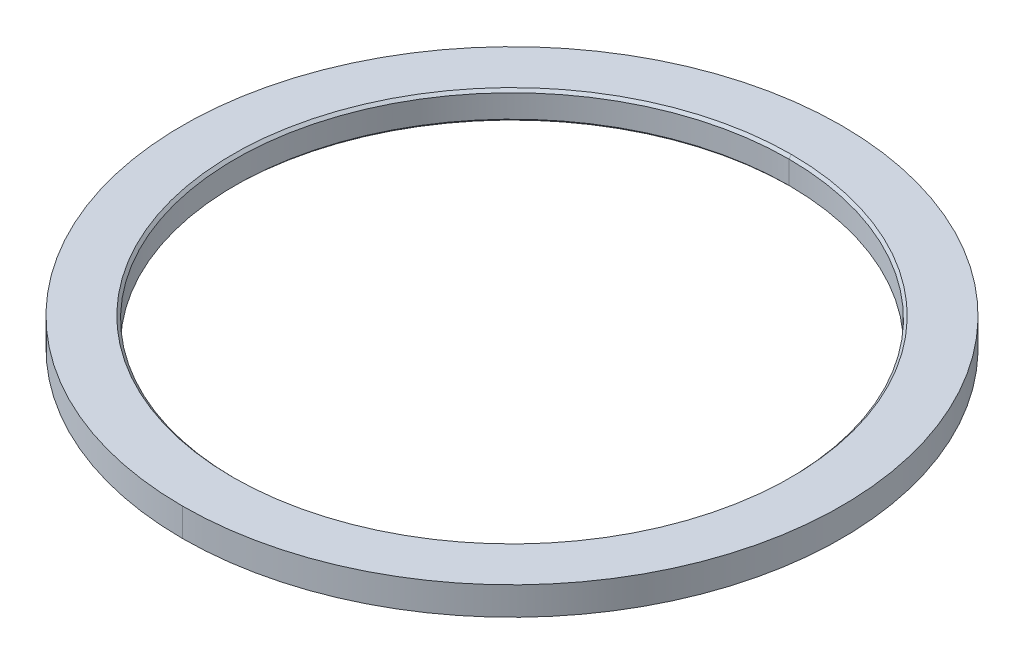
ISO-10303-21;
HEADER;
FILE_DESCRIPTION(('STEP AP214'),'2;1');
FILE_NAME('part.step','',(''),(''),'','','');
FILE_SCHEMA(('AUTOMOTIVE_DESIGN { 1 0 10303 214 1 1 1 1 }'));
ENDSEC;
DATA;
#1=APPLICATION_CONTEXT('core data for automotive mechanical design processes');
#2=APPLICATION_PROTOCOL_DEFINITION('international standard','automotive_design',2000,#1);
#3=PRODUCT_CONTEXT('',#1,'mechanical');
#4=PRODUCT('Part','Part','',(#3));
#5=PRODUCT_RELATED_PRODUCT_CATEGORY('part','',(#4));
#6=PRODUCT_DEFINITION_FORMATION('','',#4);
#7=PRODUCT_DEFINITION_CONTEXT('part definition',#1,'design');
#8=PRODUCT_DEFINITION('design','',#6,#7);
#9=PRODUCT_DEFINITION_SHAPE('','',#8);
#10=(LENGTH_UNIT() NAMED_UNIT(*) SI_UNIT(.MILLI.,.METRE.));
#11=(NAMED_UNIT(*) PLANE_ANGLE_UNIT() SI_UNIT($,.RADIAN.));
#12=(NAMED_UNIT(*) SI_UNIT($,.STERADIAN.) SOLID_ANGLE_UNIT());
#13=UNCERTAINTY_MEASURE_WITH_UNIT(LENGTH_MEASURE(1.E-05),#10,'distance_accuracy_value','');
#14=(GEOMETRIC_REPRESENTATION_CONTEXT(3) GLOBAL_UNCERTAINTY_ASSIGNED_CONTEXT((#13)) GLOBAL_UNIT_ASSIGNED_CONTEXT((#10,
#11,#12)) REPRESENTATION_CONTEXT('',''));
#15=CARTESIAN_POINT('',(0.,0.,0.));
#16=DIRECTION('',(0.,0.,1.));
#17=DIRECTION('',(1.,0.,0.));
#18=AXIS2_PLACEMENT_3D('',#15,#16,#17);
#19=CARTESIAN_POINT('',(0.,3.2,0.));
#20=DIRECTION('',(0.,1.,0.));
#21=DIRECTION('',(-1.,0.,0.));
#22=AXIS2_PLACEMENT_3D('',#19,#20,#21);
#23=CONICAL_SURFACE('',#22,31.8,0.785398163397452);
#24=CARTESIAN_POINT('',(0.,2.9,0.));
#25=DIRECTION('',(0.,-1.,0.));
#26=DIRECTION('',(0.,0.,-1.));
#27=AXIS2_PLACEMENT_3D('',#24,#25,#26);
#28=CIRCLE('',#27,31.5);
#29=CARTESIAN_POINT('',(0.,2.9,-31.5));
#30=VERTEX_POINT('',#29);
#31=CARTESIAN_POINT('',(0.,2.9,31.5));
#32=VERTEX_POINT('',#31);
#33=EDGE_CURVE('E100',#30,#32,#28,.T.);
#34=ORIENTED_EDGE('',*,*,#33,.T.);
#35=DIRECTION('',(0.,-0.707106781186546,-0.70710678118655));
#36=VECTOR('',#35,1.);
#37=CARTESIAN_POINT('',(0.,2.9,31.5));
#38=LINE('',#37,#36);
#39=CARTESIAN_POINT('',(0.,3.2,31.8));
#40=VERTEX_POINT('',#39);
#41=EDGE_CURVE('E67',#32,#40,#38,.F.);
#42=ORIENTED_EDGE('',*,*,#41,.T.);
#43=CARTESIAN_POINT('',(0.,3.2,0.));
#44=DIRECTION('',(0.,1.,0.));
#45=DIRECTION('',(-1.,0.,0.));
#46=AXIS2_PLACEMENT_3D('',#43,#44,#45);
#47=CIRCLE('',#46,31.8);
#48=CARTESIAN_POINT('',(0.,3.2,-31.8));
#49=VERTEX_POINT('',#48);
#50=EDGE_CURVE('E21',#40,#49,#47,.T.);
#51=ORIENTED_EDGE('',*,*,#50,.T.);
#52=DIRECTION('',(0.,-0.707106781186546,0.70710678118655));
#53=VECTOR('',#52,1.);
#54=CARTESIAN_POINT('',(0.,2.9,-31.5));
#55=LINE('',#54,#53);
#56=EDGE_CURVE('E124',#49,#30,#55,.T.);
#57=ORIENTED_EDGE('',*,*,#56,.T.);
#58=EDGE_LOOP('',(#34,#42,#51,#57));
#59=FACE_BOUND('',#58,.T.);
#60=ADVANCED_FACE('F18',(#59),#23,.F.);
#61=CARTESIAN_POINT('',(0.,3.2,0.));
#62=DIRECTION('',(0.,1.,0.));
#63=DIRECTION('',(-1.,0.,0.));
#64=AXIS2_PLACEMENT_3D('',#61,#62,#63);
#65=CONICAL_SURFACE('',#64,31.8,0.785398163397452);
#66=ORIENTED_EDGE('',*,*,#56,.F.);
#67=CARTESIAN_POINT('',(0.,3.2,0.));
#68=DIRECTION('',(0.,1.,0.));
#69=DIRECTION('',(-1.,0.,0.));
#70=AXIS2_PLACEMENT_3D('',#67,#68,#69);
#71=CIRCLE('',#70,31.8);
#72=EDGE_CURVE('E90',#49,#40,#71,.T.);
#73=ORIENTED_EDGE('',*,*,#72,.T.);
#74=ORIENTED_EDGE('',*,*,#41,.F.);
#75=CARTESIAN_POINT('',(0.,2.9,0.));
#76=DIRECTION('',(0.,-1.,0.));
#77=DIRECTION('',(0.,0.,-1.));
#78=AXIS2_PLACEMENT_3D('',#75,#76,#77);
#79=CIRCLE('',#78,31.5);
#80=EDGE_CURVE('E95',#32,#30,#79,.T.);
#81=ORIENTED_EDGE('',*,*,#80,.T.);
#82=EDGE_LOOP('',(#66,#73,#74,#81));
#83=FACE_BOUND('',#82,.T.);
#84=ADVANCED_FACE('F145',(#83),#65,.F.);
#85=CARTESIAN_POINT('',(0.,0.,0.));
#86=DIRECTION('',(0.,-1.,0.));
#87=DIRECTION('',(0.,0.,-1.));
#88=AXIS2_PLACEMENT_3D('',#85,#86,#87);
#89=CYLINDRICAL_SURFACE('',#88,31.5);
#90=DIRECTION('',(0.,-1.,0.));
#91=VECTOR('',#90,1.);
#92=CARTESIAN_POINT('',(0.,0.,31.5));
#93=LINE('',#92,#91);
#94=CARTESIAN_POINT('',(0.,0.300000000000001,31.5));
#95=VERTEX_POINT('',#94);
#96=EDGE_CURVE('E93',#32,#95,#93,.T.);
#97=ORIENTED_EDGE('',*,*,#96,.T.);
#98=CARTESIAN_POINT('',(0.,0.300000000000002,0.));
#99=DIRECTION('',(0.,-1.,0.));
#100=DIRECTION('',(0.,0.,-1.));
#101=AXIS2_PLACEMENT_3D('',#98,#99,#100);
#102=CIRCLE('',#101,31.5);
#103=CARTESIAN_POINT('',(0.,0.300000000000001,-31.5));
#104=VERTEX_POINT('',#103);
#105=EDGE_CURVE('E79',#95,#104,#102,.T.);
#106=ORIENTED_EDGE('',*,*,#105,.T.);
#107=DIRECTION('',(0.,-1.,0.));
#108=VECTOR('',#107,1.);
#109=CARTESIAN_POINT('',(0.,0.,-31.5));
#110=LINE('',#109,#108);
#111=EDGE_CURVE('E110',#104,#30,#110,.F.);
#112=ORIENTED_EDGE('',*,*,#111,.T.);
#113=ORIENTED_EDGE('',*,*,#80,.F.);
#114=EDGE_LOOP('',(#97,#106,#112,#113));
#115=FACE_BOUND('',#114,.T.);
#116=ADVANCED_FACE('F94',(#115),#89,.F.);
#117=CARTESIAN_POINT('',(0.,0.,0.));
#118=DIRECTION('',(0.,-1.,0.));
#119=DIRECTION('',(0.,0.,-1.));
#120=AXIS2_PLACEMENT_3D('',#117,#118,#119);
#121=CYLINDRICAL_SURFACE('',#120,31.5);
#122=ORIENTED_EDGE('',*,*,#33,.F.);
#123=ORIENTED_EDGE('',*,*,#111,.F.);
#124=CARTESIAN_POINT('',(0.,0.300000000000002,0.));
#125=DIRECTION('',(0.,-1.,0.));
#126=DIRECTION('',(0.,0.,-1.));
#127=AXIS2_PLACEMENT_3D('',#124,#125,#126);
#128=CIRCLE('',#127,31.5);
#129=EDGE_CURVE('E104',#104,#95,#128,.T.);
#130=ORIENTED_EDGE('',*,*,#129,.T.);
#131=ORIENTED_EDGE('',*,*,#96,.F.);
#132=EDGE_LOOP('',(#122,#123,#130,#131));
#133=FACE_BOUND('',#132,.T.);
#134=ADVANCED_FACE('F109',(#133),#121,.F.);
#135=CARTESIAN_POINT('',(-33.25,3.2,0.));
#136=DIRECTION('',(0.,-1.,0.));
#137=DIRECTION('',(0.,0.,-1.));
#138=AXIS2_PLACEMENT_3D('',#135,#136,#137);
#139=PLANE('',#138);
#140=CARTESIAN_POINT('',(0.,3.19999999999999,0.));
#141=DIRECTION('',(0.,1.,0.));
#142=DIRECTION('',(0.,0.,1.));
#143=AXIS2_PLACEMENT_3D('',#140,#141,#142);
#144=CIRCLE('',#143,37.5);
#145=CARTESIAN_POINT('',(0.,3.19999999999999,37.5));
#146=VERTEX_POINT('',#145);
#147=CARTESIAN_POINT('',(0.,3.19999999999999,-37.5));
#148=VERTEX_POINT('',#147);
#149=EDGE_CURVE('E141',#146,#148,#144,.F.);
#150=ORIENTED_EDGE('',*,*,#149,.F.);
#151=CARTESIAN_POINT('',(0.,3.19999999999999,0.));
#152=DIRECTION('',(0.,1.,0.));
#153=DIRECTION('',(0.,0.,1.));
#154=AXIS2_PLACEMENT_3D('',#151,#152,#153);
#155=CIRCLE('',#154,37.5);
#156=EDGE_CURVE('E107',#148,#146,#155,.F.);
#157=ORIENTED_EDGE('',*,*,#156,.F.);
#158=EDGE_LOOP('',(#150,#157));
#159=FACE_BOUND('',#158,.T.);
#160=ORIENTED_EDGE('',*,*,#50,.F.);
#161=ORIENTED_EDGE('',*,*,#72,.F.);
#162=EDGE_LOOP('',(#160,#161));
#163=FACE_BOUND('',#162,.T.);
#164=ADVANCED_FACE('F172',(#159,#163),#139,.F.);
#165=CARTESIAN_POINT('',(0.,0.,0.));
#166=DIRECTION('',(0.,-1.,0.));
#167=DIRECTION('',(0.,0.,-1.));
#168=AXIS2_PLACEMENT_3D('',#165,#166,#167);
#169=CONICAL_SURFACE('',#168,31.8,0.785398163397452);
#170=DIRECTION('',(0.,0.707106781186546,-0.70710678118655));
#171=VECTOR('',#170,1.);
#172=CARTESIAN_POINT('',(0.,0.,31.8));
#173=LINE('',#172,#171);
#174=CARTESIAN_POINT('',(0.,0.,31.8));
#175=VERTEX_POINT('',#174);
#176=EDGE_CURVE('E84',#95,#175,#173,.F.);
#177=ORIENTED_EDGE('',*,*,#176,.T.);
#178=CARTESIAN_POINT('',(0.,0.,0.));
#179=DIRECTION('',(0.,-1.,0.));
#180=DIRECTION('',(0.,0.,-1.));
#181=AXIS2_PLACEMENT_3D('',#178,#179,#180);
#182=CIRCLE('',#181,31.8);
#183=CARTESIAN_POINT('',(0.,0.,-31.8));
#184=VERTEX_POINT('',#183);
#185=EDGE_CURVE('E139',#175,#184,#182,.T.);
#186=ORIENTED_EDGE('',*,*,#185,.T.);
#187=DIRECTION('',(0.,0.707106781186546,0.70710678118655));
#188=VECTOR('',#187,1.);
#189=CARTESIAN_POINT('',(0.,0.,-31.8));
#190=LINE('',#189,#188);
#191=EDGE_CURVE('E86',#184,#104,#190,.T.);
#192=ORIENTED_EDGE('',*,*,#191,.T.);
#193=ORIENTED_EDGE('',*,*,#105,.F.);
#194=EDGE_LOOP('',(#177,#186,#192,#193));
#195=FACE_BOUND('',#194,.T.);
#196=ADVANCED_FACE('F81',(#195),#169,.F.);
#197=CARTESIAN_POINT('',(0.,0.,0.));
#198=DIRECTION('',(0.,-1.,0.));
#199=DIRECTION('',(0.,0.,-1.));
#200=AXIS2_PLACEMENT_3D('',#197,#198,#199);
#201=CONICAL_SURFACE('',#200,31.8,0.785398163397452);
#202=ORIENTED_EDGE('',*,*,#129,.F.);
#203=ORIENTED_EDGE('',*,*,#191,.F.);
#204=CARTESIAN_POINT('',(0.,0.,0.));
#205=DIRECTION('',(0.,-1.,0.));
#206=DIRECTION('',(0.,0.,-1.));
#207=AXIS2_PLACEMENT_3D('',#204,#205,#206);
#208=CIRCLE('',#207,31.8);
#209=EDGE_CURVE('E106',#184,#175,#208,.T.);
#210=ORIENTED_EDGE('',*,*,#209,.T.);
#211=ORIENTED_EDGE('',*,*,#176,.F.);
#212=EDGE_LOOP('',(#202,#203,#210,#211));
#213=FACE_BOUND('',#212,.T.);
#214=ADVANCED_FACE('F103',(#213),#201,.F.);
#215=CARTESIAN_POINT('',(0.,-106.066017177982,0.));
#216=DIRECTION('',(0.,1.,0.));
#217=DIRECTION('',(0.,0.,1.));
#218=AXIS2_PLACEMENT_3D('',#215,#216,#217);
#219=CYLINDRICAL_SURFACE('',#218,37.5);
#220=ORIENTED_EDGE('',*,*,#156,.T.);
#221=DIRECTION('',(0.,1.,0.));
#222=VECTOR('',#221,1.);
#223=CARTESIAN_POINT('',(0.,-106.066017177982,37.5));
#224=LINE('',#223,#222);
#225=CARTESIAN_POINT('',(0.,0.,37.5));
#226=VERTEX_POINT('',#225);
#227=EDGE_CURVE('E143',#226,#146,#224,.T.);
#228=ORIENTED_EDGE('',*,*,#227,.F.);
#229=CARTESIAN_POINT('',(0.,0.,0.));
#230=DIRECTION('',(0.,1.,0.));
#231=DIRECTION('',(0.,0.,1.));
#232=AXIS2_PLACEMENT_3D('',#229,#230,#231);
#233=CIRCLE('',#232,37.5);
#234=CARTESIAN_POINT('',(0.,0.,-37.5));
#235=VERTEX_POINT('',#234);
#236=EDGE_CURVE('E27',#226,#235,#233,.T.);
#237=ORIENTED_EDGE('',*,*,#236,.T.);
#238=DIRECTION('',(0.,1.,0.));
#239=VECTOR('',#238,1.);
#240=CARTESIAN_POINT('',(0.,-106.066017177982,-37.5));
#241=LINE('',#240,#239);
#242=EDGE_CURVE('E35',#148,#235,#241,.F.);
#243=ORIENTED_EDGE('',*,*,#242,.F.);
#244=EDGE_LOOP('',(#220,#228,#237,#243));
#245=FACE_BOUND('',#244,.T.);
#246=ADVANCED_FACE('F161',(#245),#219,.T.);
#247=CARTESIAN_POINT('',(0.,-106.066017177982,0.));
#248=DIRECTION('',(0.,1.,0.));
#249=DIRECTION('',(0.,0.,1.));
#250=AXIS2_PLACEMENT_3D('',#247,#248,#249);
#251=CYLINDRICAL_SURFACE('',#250,37.5);
#252=ORIENTED_EDGE('',*,*,#227,.T.);
#253=ORIENTED_EDGE('',*,*,#149,.T.);
#254=ORIENTED_EDGE('',*,*,#242,.T.);
#255=CARTESIAN_POINT('',(0.,0.,0.));
#256=DIRECTION('',(0.,1.,0.));
#257=DIRECTION('',(0.,0.,1.));
#258=AXIS2_PLACEMENT_3D('',#255,#256,#257);
#259=CIRCLE('',#258,37.5);
#260=EDGE_CURVE('E11',#235,#226,#259,.T.);
#261=ORIENTED_EDGE('',*,*,#260,.T.);
#262=EDGE_LOOP('',(#252,#253,#254,#261));
#263=FACE_BOUND('',#262,.T.);
#264=ADVANCED_FACE('F155',(#263),#251,.T.);
#265=CARTESIAN_POINT('',(-33.25,0.,0.));
#266=DIRECTION('',(0.,1.,0.));
#267=DIRECTION('',(0.,0.,1.));
#268=AXIS2_PLACEMENT_3D('',#265,#266,#267);
#269=PLANE('',#268);
#270=ORIENTED_EDGE('',*,*,#236,.F.);
#271=ORIENTED_EDGE('',*,*,#260,.F.);
#272=EDGE_LOOP('',(#270,#271));
#273=FACE_BOUND('',#272,.T.);
#274=ORIENTED_EDGE('',*,*,#185,.F.);
#275=ORIENTED_EDGE('',*,*,#209,.F.);
#276=EDGE_LOOP('',(#274,#275));
#277=FACE_BOUND('',#276,.T.);
#278=ADVANCED_FACE('F153',(#273,#277),#269,.F.);
#279=CLOSED_SHELL('',(#60,#84,#116,#134,#164,#196,#214,#246,#264,#278));
#280=MANIFOLD_SOLID_BREP('B1',#279);
#281=ADVANCED_BREP_SHAPE_REPRESENTATION('',(#18,#280),#14);
#282=SHAPE_DEFINITION_REPRESENTATION(#9,#281);
ENDSEC;
END-ISO-10303-21;
